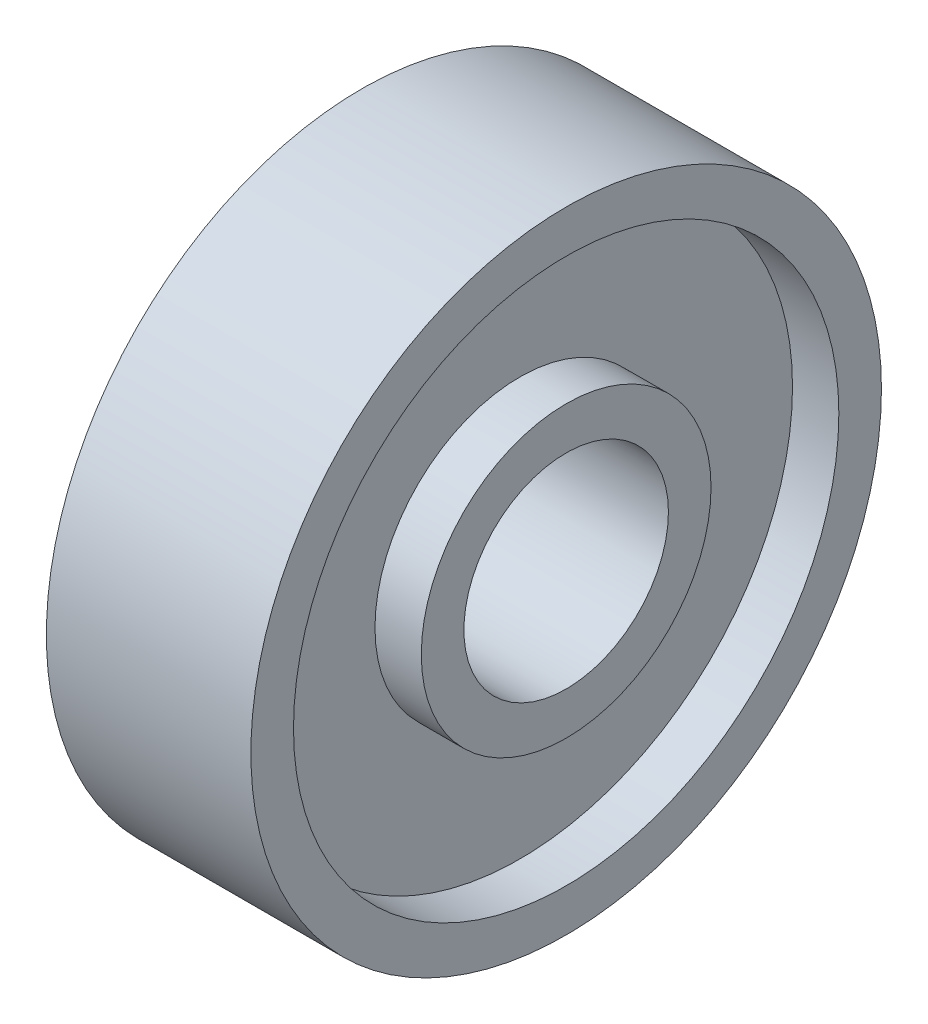
ISO-10303-21;
HEADER;
FILE_DESCRIPTION(('STEP AP214'),'2;1');
FILE_NAME('part.step','',(''),(''),'','','');
FILE_SCHEMA(('AUTOMOTIVE_DESIGN { 1 0 10303 214 1 1 1 1 }'));
ENDSEC;
DATA;
#1=APPLICATION_CONTEXT('core data for automotive mechanical design processes');
#2=APPLICATION_PROTOCOL_DEFINITION('international standard','automotive_design',2000,#1);
#3=PRODUCT_CONTEXT('',#1,'mechanical');
#4=PRODUCT('Part','Part','',(#3));
#5=PRODUCT_RELATED_PRODUCT_CATEGORY('part','',(#4));
#6=PRODUCT_DEFINITION_FORMATION('','',#4);
#7=PRODUCT_DEFINITION_CONTEXT('part definition',#1,'design');
#8=PRODUCT_DEFINITION('design','',#6,#7);
#9=PRODUCT_DEFINITION_SHAPE('','',#8);
#10=(LENGTH_UNIT() NAMED_UNIT(*) SI_UNIT(.MILLI.,.METRE.));
#11=(NAMED_UNIT(*) PLANE_ANGLE_UNIT() SI_UNIT($,.RADIAN.));
#12=(NAMED_UNIT(*) SI_UNIT($,.STERADIAN.) SOLID_ANGLE_UNIT());
#13=UNCERTAINTY_MEASURE_WITH_UNIT(LENGTH_MEASURE(1.E-05),#10,'distance_accuracy_value','');
#14=(GEOMETRIC_REPRESENTATION_CONTEXT(3) GLOBAL_UNCERTAINTY_ASSIGNED_CONTEXT((#13)) GLOBAL_UNIT_ASSIGNED_CONTEXT((#10,
#11,#12)) REPRESENTATION_CONTEXT('',''));
#15=CARTESIAN_POINT('',(0.,0.,0.));
#16=DIRECTION('',(0.,0.,1.));
#17=DIRECTION('',(1.,0.,0.));
#18=AXIS2_PLACEMENT_3D('',#15,#16,#17);
#19=CARTESIAN_POINT('',(-6.,0.,0.));
#20=DIRECTION('',(1.,0.,0.));
#21=DIRECTION('',(0.,0.,-1.));
#22=AXIS2_PLACEMENT_3D('',#19,#20,#21);
#23=PLANE('',#22);
#24=CARTESIAN_POINT('',(-6.,0.,0.));
#25=DIRECTION('',(1.,0.,0.));
#26=DIRECTION('',(0.,0.,-1.));
#27=AXIS2_PLACEMENT_3D('',#24,#25,#26);
#28=CIRCLE('',#27,8.5);
#29=CARTESIAN_POINT('',(-6.,0.,-8.5));
#30=VERTEX_POINT('',#29);
#31=EDGE_CURVE('E38',#30,#30,#28,.T.);
#32=ORIENTED_EDGE('',*,*,#31,.F.);
#33=EDGE_LOOP('',(#32));
#34=FACE_BOUND('',#33,.T.);
#35=CARTESIAN_POINT('',(-6.,0.,0.));
#36=DIRECTION('',(1.,0.,0.));
#37=DIRECTION('',(0.,0.,-1.));
#38=AXIS2_PLACEMENT_3D('',#35,#36,#37);
#39=CIRCLE('',#38,6.);
#40=CARTESIAN_POINT('',(-6.,0.,-6.));
#41=VERTEX_POINT('',#40);
#42=EDGE_CURVE('E50',#41,#41,#39,.T.);
#43=ORIENTED_EDGE('',*,*,#42,.T.);
#44=EDGE_LOOP('',(#43));
#45=FACE_BOUND('',#44,.T.);
#46=ADVANCED_FACE('F34',(#34,#45),#23,.F.);
#47=CARTESIAN_POINT('',(6.,0.,0.));
#48=DIRECTION('',(1.,0.,0.));
#49=DIRECTION('',(0.,0.,-1.));
#50=AXIS2_PLACEMENT_3D('',#47,#48,#49);
#51=PLANE('',#50);
#52=CARTESIAN_POINT('',(6.,0.,0.));
#53=DIRECTION('',(1.,0.,0.));
#54=DIRECTION('',(0.,0.,-1.));
#55=AXIS2_PLACEMENT_3D('',#52,#53,#54);
#56=CIRCLE('',#55,18.5);
#57=CARTESIAN_POINT('',(6.,0.,-18.5));
#58=VERTEX_POINT('',#57);
#59=EDGE_CURVE('E10',#58,#58,#56,.T.);
#60=ORIENTED_EDGE('',*,*,#59,.T.);
#61=EDGE_LOOP('',(#60));
#62=FACE_BOUND('',#61,.T.);
#63=CARTESIAN_POINT('',(6.,0.,0.));
#64=DIRECTION('',(1.,0.,0.));
#65=DIRECTION('',(0.,0.,-1.));
#66=AXIS2_PLACEMENT_3D('',#63,#64,#65);
#67=CIRCLE('',#66,16.);
#68=CARTESIAN_POINT('',(6.,0.,-16.));
#69=VERTEX_POINT('',#68);
#70=EDGE_CURVE('E56',#69,#69,#67,.F.);
#71=ORIENTED_EDGE('',*,*,#70,.T.);
#72=EDGE_LOOP('',(#71));
#73=FACE_BOUND('',#72,.T.);
#74=ADVANCED_FACE('F100',(#62,#73),#51,.T.);
#75=CARTESIAN_POINT('',(6.,0.,0.));
#76=DIRECTION('',(1.,0.,0.));
#77=DIRECTION('',(0.,0.,-1.));
#78=AXIS2_PLACEMENT_3D('',#75,#76,#77);
#79=CIRCLE('',#78,6.);
#80=CARTESIAN_POINT('',(6.,0.,-6.));
#81=VERTEX_POINT('',#80);
#82=EDGE_CURVE('E47',#81,#81,#79,.T.);
#83=ORIENTED_EDGE('',*,*,#82,.F.);
#84=EDGE_LOOP('',(#83));
#85=FACE_BOUND('',#84,.T.);
#86=CARTESIAN_POINT('',(6.,0.,0.));
#87=DIRECTION('',(1.,0.,0.));
#88=DIRECTION('',(0.,0.,-1.));
#89=AXIS2_PLACEMENT_3D('',#86,#87,#88);
#90=CIRCLE('',#89,8.5);
#91=CARTESIAN_POINT('',(6.,0.,-8.5));
#92=VERTEX_POINT('',#91);
#93=EDGE_CURVE('E53',#92,#92,#90,.T.);
#94=ORIENTED_EDGE('',*,*,#93,.T.);
#95=EDGE_LOOP('',(#94));
#96=FACE_BOUND('',#95,.T.);
#97=ADVANCED_FACE('F105',(#85,#96),#51,.T.);
#98=CARTESIAN_POINT('',(-6.,0.,0.));
#99=DIRECTION('',(1.,0.,0.));
#100=DIRECTION('',(0.,0.,-1.));
#101=AXIS2_PLACEMENT_3D('',#98,#99,#100);
#102=CIRCLE('',#101,16.);
#103=CARTESIAN_POINT('',(-6.,0.,-16.));
#104=VERTEX_POINT('',#103);
#105=EDGE_CURVE('E59',#104,#104,#102,.F.);
#106=ORIENTED_EDGE('',*,*,#105,.F.);
#107=EDGE_LOOP('',(#106));
#108=FACE_BOUND('',#107,.T.);
#109=CARTESIAN_POINT('',(-6.,0.,0.));
#110=DIRECTION('',(1.,0.,0.));
#111=DIRECTION('',(0.,0.,-1.));
#112=AXIS2_PLACEMENT_3D('',#109,#110,#111);
#113=CIRCLE('',#112,18.5);
#114=CARTESIAN_POINT('',(-6.,0.,-18.5));
#115=VERTEX_POINT('',#114);
#116=EDGE_CURVE('E42',#115,#115,#113,.T.);
#117=ORIENTED_EDGE('',*,*,#116,.F.);
#118=EDGE_LOOP('',(#117));
#119=FACE_BOUND('',#118,.T.);
#120=ADVANCED_FACE('F96',(#108,#119),#23,.F.);
#121=CARTESIAN_POINT('',(6.,0.,0.));
#122=DIRECTION('',(-1.,0.,0.));
#123=DIRECTION('',(0.,0.,1.));
#124=AXIS2_PLACEMENT_3D('',#121,#122,#123);
#125=CYLINDRICAL_SURFACE('',#124,18.5);
#126=ORIENTED_EDGE('',*,*,#59,.F.);
#127=EDGE_LOOP('',(#126));
#128=FACE_BOUND('',#127,.T.);
#129=ORIENTED_EDGE('',*,*,#116,.T.);
#130=EDGE_LOOP('',(#129));
#131=FACE_BOUND('',#130,.T.);
#132=ADVANCED_FACE('F36',(#128,#131),#125,.T.);
#133=CARTESIAN_POINT('',(6.,0.,0.));
#134=DIRECTION('',(-1.,0.,0.));
#135=DIRECTION('',(0.,0.,1.));
#136=AXIS2_PLACEMENT_3D('',#133,#134,#135);
#137=CYLINDRICAL_SURFACE('',#136,6.);
#138=ORIENTED_EDGE('',*,*,#82,.T.);
#139=EDGE_LOOP('',(#138));
#140=FACE_BOUND('',#139,.T.);
#141=ORIENTED_EDGE('',*,*,#42,.F.);
#142=EDGE_LOOP('',(#141));
#143=FACE_BOUND('',#142,.T.);
#144=ADVANCED_FACE('F84',(#140,#143),#137,.F.);
#145=CARTESIAN_POINT('',(0.,0.,0.));
#146=DIRECTION('',(-1.,0.,0.));
#147=DIRECTION('',(0.,0.,1.));
#148=AXIS2_PLACEMENT_3D('',#145,#146,#147);
#149=CYLINDRICAL_SURFACE('',#148,16.);
#150=ORIENTED_EDGE('',*,*,#70,.F.);
#151=EDGE_LOOP('',(#150));
#152=FACE_BOUND('',#151,.T.);
#153=CARTESIAN_POINT('',(3.28115712996446,0.,0.));
#154=DIRECTION('',(-1.,0.,0.));
#155=DIRECTION('',(0.,0.,1.));
#156=AXIS2_PLACEMENT_3D('',#153,#154,#155);
#157=CIRCLE('',#156,16.);
#158=CARTESIAN_POINT('',(3.28115712996446,0.,16.));
#159=VERTEX_POINT('',#158);
#160=EDGE_CURVE('E65',#159,#159,#157,.T.);
#161=ORIENTED_EDGE('',*,*,#160,.T.);
#162=EDGE_LOOP('',(#161));
#163=FACE_BOUND('',#162,.T.);
#164=ADVANCED_FACE('F86',(#152,#163),#149,.F.);
#165=CARTESIAN_POINT('',(0.,0.,0.));
#166=DIRECTION('',(-1.,0.,0.));
#167=DIRECTION('',(0.,0.,1.));
#168=AXIS2_PLACEMENT_3D('',#165,#166,#167);
#169=CYLINDRICAL_SURFACE('',#168,8.5);
#170=ORIENTED_EDGE('',*,*,#93,.F.);
#171=EDGE_LOOP('',(#170));
#172=FACE_BOUND('',#171,.T.);
#173=CARTESIAN_POINT('',(3.28115712996446,0.,0.));
#174=DIRECTION('',(-1.,0.,0.));
#175=DIRECTION('',(0.,0.,1.));
#176=AXIS2_PLACEMENT_3D('',#173,#174,#175);
#177=CIRCLE('',#176,8.5);
#178=CARTESIAN_POINT('',(3.28115712996446,0.,8.5));
#179=VERTEX_POINT('',#178);
#180=EDGE_CURVE('E57',#179,#179,#177,.T.);
#181=ORIENTED_EDGE('',*,*,#180,.F.);
#182=EDGE_LOOP('',(#181));
#183=FACE_BOUND('',#182,.T.);
#184=ADVANCED_FACE('F93',(#172,#183),#169,.T.);
#185=CARTESIAN_POINT('',(3.28115712996446,16.,0.));
#186=DIRECTION('',(1.,0.,0.));
#187=DIRECTION('',(0.,0.,-1.));
#188=AXIS2_PLACEMENT_3D('',#185,#186,#187);
#189=PLANE('',#188);
#190=ORIENTED_EDGE('',*,*,#180,.T.);
#191=EDGE_LOOP('',(#190));
#192=FACE_BOUND('',#191,.T.);
#193=ORIENTED_EDGE('',*,*,#160,.F.);
#194=EDGE_LOOP('',(#193));
#195=FACE_BOUND('',#194,.T.);
#196=ADVANCED_FACE('F124',(#192,#195),#189,.T.);
#197=CARTESIAN_POINT('',(0.,0.,0.));
#198=DIRECTION('',(-1.,0.,0.));
#199=DIRECTION('',(0.,0.,1.));
#200=AXIS2_PLACEMENT_3D('',#197,#198,#199);
#201=CYLINDRICAL_SURFACE('',#200,8.5);
#202=CARTESIAN_POINT('',(-3.28115712996446,0.,0.));
#203=DIRECTION('',(-1.,0.,0.));
#204=DIRECTION('',(0.,0.,1.));
#205=AXIS2_PLACEMENT_3D('',#202,#203,#204);
#206=CIRCLE('',#205,8.5);
#207=CARTESIAN_POINT('',(-3.28115712996446,0.,8.5));
#208=VERTEX_POINT('',#207);
#209=EDGE_CURVE('E61',#208,#208,#206,.T.);
#210=ORIENTED_EDGE('',*,*,#209,.T.);
#211=EDGE_LOOP('',(#210));
#212=FACE_BOUND('',#211,.T.);
#213=ORIENTED_EDGE('',*,*,#31,.T.);
#214=EDGE_LOOP('',(#213));
#215=FACE_BOUND('',#214,.T.);
#216=ADVANCED_FACE('F130',(#212,#215),#201,.T.);
#217=CARTESIAN_POINT('',(0.,0.,0.));
#218=DIRECTION('',(-1.,0.,0.));
#219=DIRECTION('',(0.,0.,1.));
#220=AXIS2_PLACEMENT_3D('',#217,#218,#219);
#221=CYLINDRICAL_SURFACE('',#220,16.);
#222=CARTESIAN_POINT('',(-3.28115712996446,0.,0.));
#223=DIRECTION('',(-1.,0.,0.));
#224=DIRECTION('',(0.,0.,1.));
#225=AXIS2_PLACEMENT_3D('',#222,#223,#224);
#226=CIRCLE('',#225,16.);
#227=CARTESIAN_POINT('',(-3.28115712996446,0.,16.));
#228=VERTEX_POINT('',#227);
#229=EDGE_CURVE('E67',#228,#228,#226,.T.);
#230=ORIENTED_EDGE('',*,*,#229,.F.);
#231=EDGE_LOOP('',(#230));
#232=FACE_BOUND('',#231,.T.);
#233=ORIENTED_EDGE('',*,*,#105,.T.);
#234=EDGE_LOOP('',(#233));
#235=FACE_BOUND('',#234,.T.);
#236=ADVANCED_FACE('F137',(#232,#235),#221,.F.);
#237=CARTESIAN_POINT('',(-3.28115712996446,16.,0.));
#238=DIRECTION('',(-1.,0.,0.));
#239=DIRECTION('',(0.,0.,1.));
#240=AXIS2_PLACEMENT_3D('',#237,#238,#239);
#241=PLANE('',#240);
#242=ORIENTED_EDGE('',*,*,#229,.T.);
#243=EDGE_LOOP('',(#242));
#244=FACE_BOUND('',#243,.T.);
#245=ORIENTED_EDGE('',*,*,#209,.F.);
#246=EDGE_LOOP('',(#245));
#247=FACE_BOUND('',#246,.T.);
#248=ADVANCED_FACE('F140',(#244,#247),#241,.T.);
#249=CLOSED_SHELL('',(#46,#74,#97,#120,#132,#144,#164,#184,#196,#216,#236,#248));
#250=MANIFOLD_SOLID_BREP('B2',#249);
#251=ADVANCED_BREP_SHAPE_REPRESENTATION('',(#18,#250),#14);
#252=SHAPE_DEFINITION_REPRESENTATION(#9,#251);
ENDSEC;
END-ISO-10303-21;
